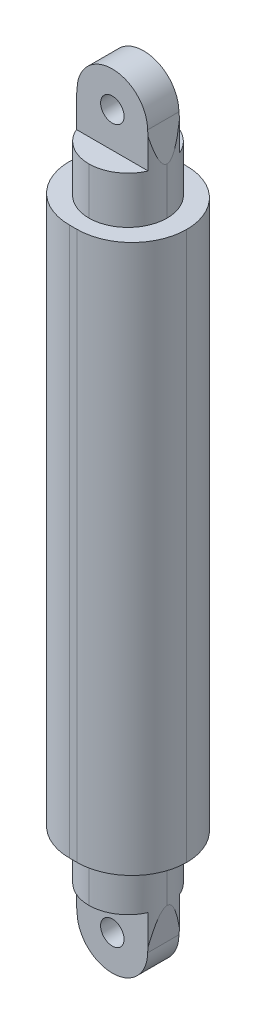
ISO-10303-21;
HEADER;
FILE_DESCRIPTION(('STEP AP214'),'2;1');
FILE_NAME('part.step','',(''),(''),'','','');
FILE_SCHEMA(('AUTOMOTIVE_DESIGN { 1 0 10303 214 1 1 1 1 }'));
ENDSEC;
DATA;
#1=APPLICATION_CONTEXT('core data for automotive mechanical design processes');
#2=APPLICATION_PROTOCOL_DEFINITION('international standard','automotive_design',2000,#1);
#3=PRODUCT_CONTEXT('',#1,'mechanical');
#4=PRODUCT('Part','Part','',(#3));
#5=PRODUCT_RELATED_PRODUCT_CATEGORY('part','',(#4));
#6=PRODUCT_DEFINITION_FORMATION('','',#4);
#7=PRODUCT_DEFINITION_CONTEXT('part definition',#1,'design');
#8=PRODUCT_DEFINITION('design','',#6,#7);
#9=PRODUCT_DEFINITION_SHAPE('','',#8);
#10=(LENGTH_UNIT() NAMED_UNIT(*) SI_UNIT(.MILLI.,.METRE.));
#11=(NAMED_UNIT(*) PLANE_ANGLE_UNIT() SI_UNIT($,.RADIAN.));
#12=(NAMED_UNIT(*) SI_UNIT($,.STERADIAN.) SOLID_ANGLE_UNIT());
#13=UNCERTAINTY_MEASURE_WITH_UNIT(LENGTH_MEASURE(1.E-05),#10,'distance_accuracy_value','');
#14=(GEOMETRIC_REPRESENTATION_CONTEXT(3) GLOBAL_UNCERTAINTY_ASSIGNED_CONTEXT((#13)) GLOBAL_UNIT_ASSIGNED_CONTEXT((#10,
#11,#12)) REPRESENTATION_CONTEXT('',''));
#15=CARTESIAN_POINT('',(0.,0.,0.));
#16=DIRECTION('',(0.,0.,1.));
#17=DIRECTION('',(1.,0.,0.));
#18=AXIS2_PLACEMENT_3D('',#15,#16,#17);
#19=CARTESIAN_POINT('',(0.,0.,5.));
#20=DIRECTION('',(0.,-1.,0.));
#21=DIRECTION('',(0.,0.,-1.));
#22=AXIS2_PLACEMENT_3D('',#19,#20,#21);
#23=CYLINDRICAL_SURFACE('',#22,5.);
#24=CARTESIAN_POINT('',(0.,-35.,5.));
#25=DIRECTION('',(0.,-1.,0.));
#26=DIRECTION('',(0.,0.,-1.));
#27=AXIS2_PLACEMENT_3D('',#24,#25,#26);
#28=CIRCLE('',#27,5.);
#29=CARTESIAN_POINT('',(-5.,-35.,5.));
#30=VERTEX_POINT('',#29);
#31=CARTESIAN_POINT('',(0.,-35.,10.));
#32=VERTEX_POINT('',#31);
#33=EDGE_CURVE('E404',#30,#32,#28,.F.);
#34=ORIENTED_EDGE('',*,*,#33,.F.);
#35=DIRECTION('',(0.,-1.,0.));
#36=VECTOR('',#35,1.);
#37=CARTESIAN_POINT('',(-5.,-50.,5.));
#38=LINE('',#37,#36);
#39=CARTESIAN_POINT('',(-5.,-41.,5.));
#40=VERTEX_POINT('',#39);
#41=EDGE_CURVE('E497',#40,#30,#38,.F.);
#42=ORIENTED_EDGE('',*,*,#41,.F.);
#43=CARTESIAN_POINT('',(0.,-85.9999999999999,5.));
#44=DIRECTION('',(0.993883734673619,0.110431526074847,0.));
#45=DIRECTION('',(0.110431526074847,-0.993883734673619,0.));
#46=AXIS2_PLACEMENT_3D('',#43,#44,#45);
#47=ELLIPSE('',#46,45.276925690687,5.);
#48=CARTESIAN_POINT('',(-4.58257569495584,-44.7568187453974,7.));
#49=VERTEX_POINT('',#48);
#50=EDGE_CURVE('E440',#49,#40,#47,.F.);
#51=ORIENTED_EDGE('',*,*,#50,.F.);
#52=DIRECTION('',(0.,-1.,0.));
#53=VECTOR('',#52,1.);
#54=CARTESIAN_POINT('',(-4.58257569495584,0.,7.));
#55=LINE('',#54,#53);
#56=CARTESIAN_POINT('',(-4.58257569495584,-41.,7.));
#57=VERTEX_POINT('',#56);
#58=EDGE_CURVE('E510',#57,#49,#55,.T.);
#59=ORIENTED_EDGE('',*,*,#58,.F.);
#60=CARTESIAN_POINT('',(0.,-41.,5.));
#61=DIRECTION('',(0.,-1.,0.));
#62=DIRECTION('',(0.,0.,-1.));
#63=AXIS2_PLACEMENT_3D('',#60,#61,#62);
#64=CIRCLE('',#63,5.);
#65=CARTESIAN_POINT('',(0.,-41.,10.));
#66=VERTEX_POINT('',#65);
#67=EDGE_CURVE('E513',#57,#66,#64,.F.);
#68=ORIENTED_EDGE('',*,*,#67,.T.);
#69=DIRECTION('',(0.,1.,0.));
#70=VECTOR('',#69,1.);
#71=CARTESIAN_POINT('',(0.,0.,10.));
#72=LINE('',#71,#70);
#73=EDGE_CURVE('E503',#66,#32,#72,.T.);
#74=ORIENTED_EDGE('',*,*,#73,.T.);
#75=EDGE_LOOP('',(#34,#42,#51,#59,#68,#74));
#76=FACE_BOUND('',#75,.T.);
#77=ADVANCED_FACE('F135',(#76),#23,.T.);
#78=CARTESIAN_POINT('',(0.,-50.,5.));
#79=DIRECTION('',(0.,1.,0.));
#80=DIRECTION('',(0.,0.,1.));
#81=AXIS2_PLACEMENT_3D('',#78,#79,#80);
#82=CYLINDRICAL_SURFACE('',#81,5.);
#83=CARTESIAN_POINT('',(0.,-35.,5.));
#84=DIRECTION('',(0.,-1.,0.));
#85=DIRECTION('',(0.,0.,-1.));
#86=AXIS2_PLACEMENT_3D('',#83,#84,#85);
#87=CIRCLE('',#86,5.);
#88=CARTESIAN_POINT('',(0.,-35.,0.));
#89=VERTEX_POINT('',#88);
#90=EDGE_CURVE('E401',#89,#30,#87,.F.);
#91=ORIENTED_EDGE('',*,*,#90,.F.);
#92=DIRECTION('',(0.,1.,0.));
#93=VECTOR('',#92,1.);
#94=CARTESIAN_POINT('',(0.,-50.,0.));
#95=LINE('',#94,#93);
#96=CARTESIAN_POINT('',(0.,-41.,0.));
#97=VERTEX_POINT('',#96);
#98=EDGE_CURVE('E500',#89,#97,#95,.F.);
#99=ORIENTED_EDGE('',*,*,#98,.T.);
#100=CARTESIAN_POINT('',(0.,-41.,5.));
#101=DIRECTION('',(0.,-1.,0.));
#102=DIRECTION('',(0.,0.,-1.));
#103=AXIS2_PLACEMENT_3D('',#100,#101,#102);
#104=CIRCLE('',#103,5.);
#105=CARTESIAN_POINT('',(-4.58257569495584,-41.,3.));
#106=VERTEX_POINT('',#105);
#107=EDGE_CURVE('E507',#97,#106,#104,.F.);
#108=ORIENTED_EDGE('',*,*,#107,.T.);
#109=DIRECTION('',(0.,1.,0.));
#110=VECTOR('',#109,1.);
#111=CARTESIAN_POINT('',(-4.58257569495584,-50.,3.));
#112=LINE('',#111,#110);
#113=CARTESIAN_POINT('',(-4.58257569495584,-44.7568187453974,3.));
#114=VERTEX_POINT('',#113);
#115=EDGE_CURVE('E320',#114,#106,#112,.T.);
#116=ORIENTED_EDGE('',*,*,#115,.F.);
#117=CARTESIAN_POINT('',(0.,-85.9999999999999,5.));
#118=DIRECTION('',(0.993883734673619,0.110431526074847,0.));
#119=DIRECTION('',(-0.110431526074847,0.993883734673619,0.));
#120=AXIS2_PLACEMENT_3D('',#117,#118,#119);
#121=ELLIPSE('',#120,45.276925690687,5.);
#122=EDGE_CURVE('E442',#40,#114,#121,.F.);
#123=ORIENTED_EDGE('',*,*,#122,.F.);
#124=ORIENTED_EDGE('',*,*,#41,.T.);
#125=EDGE_LOOP('',(#91,#99,#108,#116,#123,#124));
#126=FACE_BOUND('',#125,.T.);
#127=ADVANCED_FACE('F582',(#126),#82,.T.);
#128=CARTESIAN_POINT('',(0.,0.,5.));
#129=DIRECTION('',(0.,1.,0.));
#130=DIRECTION('',(-1.,0.,0.));
#131=AXIS2_PLACEMENT_3D('',#128,#129,#130);
#132=CYLINDRICAL_SURFACE('',#131,5.);
#133=CARTESIAN_POINT('',(0.,-35.,5.));
#134=DIRECTION('',(0.,-1.,0.));
#135=DIRECTION('',(0.,0.,-1.));
#136=AXIS2_PLACEMENT_3D('',#133,#134,#135);
#137=CIRCLE('',#136,5.);
#138=CARTESIAN_POINT('',(5.,-35.,5.));
#139=VERTEX_POINT('',#138);
#140=EDGE_CURVE('E398',#32,#139,#137,.F.);
#141=ORIENTED_EDGE('',*,*,#140,.F.);
#142=ORIENTED_EDGE('',*,*,#73,.F.);
#143=CARTESIAN_POINT('',(0.,-41.,5.));
#144=DIRECTION('',(0.,-1.,0.));
#145=DIRECTION('',(0.,0.,-1.));
#146=AXIS2_PLACEMENT_3D('',#143,#144,#145);
#147=CIRCLE('',#146,5.);
#148=CARTESIAN_POINT('',(4.58257569495584,-41.,7.));
#149=VERTEX_POINT('',#148);
#150=EDGE_CURVE('E484',#66,#149,#147,.F.);
#151=ORIENTED_EDGE('',*,*,#150,.T.);
#152=DIRECTION('',(0.,1.,0.));
#153=VECTOR('',#152,1.);
#154=CARTESIAN_POINT('',(4.58257569495584,0.,7.));
#155=LINE('',#154,#153);
#156=CARTESIAN_POINT('',(4.58257569495584,-44.7568187453974,7.));
#157=VERTEX_POINT('',#156);
#158=EDGE_CURVE('E482',#157,#149,#155,.T.);
#159=ORIENTED_EDGE('',*,*,#158,.F.);
#160=CARTESIAN_POINT('',(0.,-85.9999999999999,5.));
#161=DIRECTION('',(0.993883734673619,-0.110431526074847,0.));
#162=DIRECTION('',(0.110431526074847,0.993883734673619,0.));
#163=AXIS2_PLACEMENT_3D('',#160,#161,#162);
#164=ELLIPSE('',#163,45.2769256906869,5.);
#165=CARTESIAN_POINT('',(5.,-41.,5.));
#166=VERTEX_POINT('',#165);
#167=EDGE_CURVE('E450',#157,#166,#164,.F.);
#168=ORIENTED_EDGE('',*,*,#167,.T.);
#169=DIRECTION('',(0.,1.,0.));
#170=VECTOR('',#169,1.);
#171=CARTESIAN_POINT('',(5.,-50.,5.));
#172=LINE('',#171,#170);
#173=EDGE_CURVE('E321',#139,#166,#172,.F.);
#174=ORIENTED_EDGE('',*,*,#173,.F.);
#175=EDGE_LOOP('',(#141,#142,#151,#159,#168,#174));
#176=FACE_BOUND('',#175,.T.);
#177=ADVANCED_FACE('F589',(#176),#132,.T.);
#178=CARTESIAN_POINT('',(0.,-50.,5.));
#179=DIRECTION('',(0.,-1.,0.));
#180=DIRECTION('',(1.,0.,0.));
#181=AXIS2_PLACEMENT_3D('',#178,#179,#180);
#182=CYLINDRICAL_SURFACE('',#181,5.);
#183=CARTESIAN_POINT('',(0.,-35.,5.));
#184=DIRECTION('',(0.,-1.,0.));
#185=DIRECTION('',(0.,0.,-1.));
#186=AXIS2_PLACEMENT_3D('',#183,#184,#185);
#187=CIRCLE('',#186,5.);
#188=EDGE_CURVE('E336',#139,#89,#187,.F.);
#189=ORIENTED_EDGE('',*,*,#188,.F.);
#190=ORIENTED_EDGE('',*,*,#173,.T.);
#191=CARTESIAN_POINT('',(0.,-85.9999999999999,5.));
#192=DIRECTION('',(0.993883734673619,-0.110431526074847,0.));
#193=DIRECTION('',(-0.110431526074847,-0.993883734673619,0.));
#194=AXIS2_PLACEMENT_3D('',#191,#192,#193);
#195=ELLIPSE('',#194,45.2769256906869,5.);
#196=CARTESIAN_POINT('',(4.58257569495584,-44.7568187453974,3.));
#197=VERTEX_POINT('',#196);
#198=EDGE_CURVE('E453',#166,#197,#195,.F.);
#199=ORIENTED_EDGE('',*,*,#198,.T.);
#200=DIRECTION('',(0.,-1.,0.));
#201=VECTOR('',#200,1.);
#202=CARTESIAN_POINT('',(4.58257569495584,-50.,3.));
#203=LINE('',#202,#201);
#204=CARTESIAN_POINT('',(4.58257569495584,-41.,3.));
#205=VERTEX_POINT('',#204);
#206=EDGE_CURVE('E490',#205,#197,#203,.T.);
#207=ORIENTED_EDGE('',*,*,#206,.F.);
#208=CARTESIAN_POINT('',(0.,-41.,5.));
#209=DIRECTION('',(0.,-1.,0.));
#210=DIRECTION('',(0.,0.,-1.));
#211=AXIS2_PLACEMENT_3D('',#208,#209,#210);
#212=CIRCLE('',#211,5.);
#213=EDGE_CURVE('E493',#205,#97,#212,.F.);
#214=ORIENTED_EDGE('',*,*,#213,.T.);
#215=ORIENTED_EDGE('',*,*,#98,.F.);
#216=EDGE_LOOP('',(#189,#190,#199,#207,#214,#215));
#217=FACE_BOUND('',#216,.T.);
#218=ADVANCED_FACE('F576',(#217),#182,.T.);
#219=CARTESIAN_POINT('',(0.,-41.,3.));
#220=DIRECTION('',(0.,-1.,0.));
#221=DIRECTION('',(0.,0.,-1.));
#222=AXIS2_PLACEMENT_3D('',#219,#220,#221);
#223=PLANE('',#222);
#224=DIRECTION('',(-1.,0.,0.));
#225=VECTOR('',#224,1.);
#226=CARTESIAN_POINT('',(0.,-41.,3.));
#227=LINE('',#226,#225);
#228=EDGE_CURVE('E487',#205,#106,#227,.T.);
#229=ORIENTED_EDGE('',*,*,#228,.T.);
#230=ORIENTED_EDGE('',*,*,#107,.F.);
#231=ORIENTED_EDGE('',*,*,#213,.F.);
#232=EDGE_LOOP('',(#229,#230,#231));
#233=FACE_BOUND('',#232,.T.);
#234=ADVANCED_FACE('F607',(#233),#223,.T.);
#235=CARTESIAN_POINT('',(0.,0.,3.));
#236=DIRECTION('',(0.,0.,1.));
#237=DIRECTION('',(1.,0.,0.));
#238=AXIS2_PLACEMENT_3D('',#235,#236,#237);
#239=PLANE('',#238);
#240=CARTESIAN_POINT('',(0.,-45.5,3.));
#241=DIRECTION('',(0.,0.,-1.));
#242=DIRECTION('',(-1.,0.,0.));
#243=AXIS2_PLACEMENT_3D('',#240,#241,#242);
#244=CIRCLE('',#243,1.5);
#245=CARTESIAN_POINT('',(-1.5,-45.5,3.));
#246=VERTEX_POINT('',#245);
#247=EDGE_CURVE('E433',#246,#246,#244,.T.);
#248=ORIENTED_EDGE('',*,*,#247,.F.);
#249=EDGE_LOOP('',(#248));
#250=FACE_BOUND('',#249,.T.);
#251=CARTESIAN_POINT('',(0.,-45.5,3.));
#252=DIRECTION('',(0.,0.,1.));
#253=DIRECTION('',(1.,0.,0.));
#254=AXIS2_PLACEMENT_3D('',#251,#252,#253);
#255=CIRCLE('',#254,4.5);
#256=CARTESIAN_POINT('',(4.5,-45.5,3.));
#257=VERTEX_POINT('',#256);
#258=CARTESIAN_POINT('',(-4.5,-45.5,3.));
#259=VERTEX_POINT('',#258);
#260=EDGE_CURVE('E458',#257,#259,#255,.F.);
#261=ORIENTED_EDGE('',*,*,#260,.T.);
#262=DIRECTION('',(-0.110431526074847,0.993883734673619,0.));
#263=VECTOR('',#262,1.);
#264=CARTESIAN_POINT('',(-9.43902439024391,-1.04878048780488,3.));
#265=LINE('',#264,#263);
#266=EDGE_CURVE('E444',#259,#114,#265,.T.);
#267=ORIENTED_EDGE('',*,*,#266,.T.);
#268=ORIENTED_EDGE('',*,*,#115,.T.);
#269=ORIENTED_EDGE('',*,*,#228,.F.);
#270=ORIENTED_EDGE('',*,*,#206,.T.);
#271=DIRECTION('',(0.110431526074847,0.993883734673619,0.));
#272=VECTOR('',#271,1.);
#273=CARTESIAN_POINT('',(9.43902439024392,-1.04878048780488,3.));
#274=LINE('',#273,#272);
#275=EDGE_CURVE('E456',#257,#197,#274,.T.);
#276=ORIENTED_EDGE('',*,*,#275,.F.);
#277=EDGE_LOOP('',(#261,#267,#268,#269,#270,#276));
#278=FACE_BOUND('',#277,.T.);
#279=ADVANCED_FACE('F610',(#250,#278),#239,.F.);
#280=CARTESIAN_POINT('',(5.,-41.,10.));
#281=DIRECTION('',(0.,-1.,0.));
#282=DIRECTION('',(0.,0.,-1.));
#283=AXIS2_PLACEMENT_3D('',#280,#281,#282);
#284=PLANE('',#283);
#285=ORIENTED_EDGE('',*,*,#67,.F.);
#286=DIRECTION('',(-1.,0.,0.));
#287=VECTOR('',#286,1.);
#288=CARTESIAN_POINT('',(5.,-41.,7.));
#289=LINE('',#288,#287);
#290=EDGE_CURVE('E480',#149,#57,#289,.T.);
#291=ORIENTED_EDGE('',*,*,#290,.F.);
#292=ORIENTED_EDGE('',*,*,#150,.F.);
#293=EDGE_LOOP('',(#285,#291,#292));
#294=FACE_BOUND('',#293,.T.);
#295=ADVANCED_FACE('F614',(#294),#284,.T.);
#296=CARTESIAN_POINT('',(0.,0.,7.));
#297=DIRECTION('',(0.,0.,-1.));
#298=DIRECTION('',(-1.,0.,0.));
#299=AXIS2_PLACEMENT_3D('',#296,#297,#298);
#300=PLANE('',#299);
#301=CARTESIAN_POINT('',(0.,-45.5,7.));
#302=DIRECTION('',(0.,0.,-1.));
#303=DIRECTION('',(-1.,0.,0.));
#304=AXIS2_PLACEMENT_3D('',#301,#302,#303);
#305=CIRCLE('',#304,1.5);
#306=CARTESIAN_POINT('',(-1.5,-45.5,7.));
#307=VERTEX_POINT('',#306);
#308=EDGE_CURVE('E436',#307,#307,#305,.T.);
#309=ORIENTED_EDGE('',*,*,#308,.T.);
#310=EDGE_LOOP('',(#309));
#311=FACE_BOUND('',#310,.T.);
#312=DIRECTION('',(0.110431526074847,-0.993883734673619,0.));
#313=VECTOR('',#312,1.);
#314=CARTESIAN_POINT('',(-9.43902439024391,-1.04878048780488,7.));
#315=LINE('',#314,#313);
#316=CARTESIAN_POINT('',(-4.5,-45.5,7.));
#317=VERTEX_POINT('',#316);
#318=EDGE_CURVE('E526',#49,#317,#315,.T.);
#319=ORIENTED_EDGE('',*,*,#318,.T.);
#320=CARTESIAN_POINT('',(0.,-45.5,7.));
#321=DIRECTION('',(0.,0.,-1.));
#322=DIRECTION('',(-1.,0.,0.));
#323=AXIS2_PLACEMENT_3D('',#320,#321,#322);
#324=CIRCLE('',#323,4.5);
#325=CARTESIAN_POINT('',(4.5,-45.5,7.));
#326=VERTEX_POINT('',#325);
#327=EDGE_CURVE('E523',#317,#326,#324,.F.);
#328=ORIENTED_EDGE('',*,*,#327,.T.);
#329=DIRECTION('',(-0.110431526074847,-0.993883734673619,0.));
#330=VECTOR('',#329,1.);
#331=CARTESIAN_POINT('',(9.43902439024392,-1.04878048780488,7.));
#332=LINE('',#331,#330);
#333=EDGE_CURVE('E521',#157,#326,#332,.T.);
#334=ORIENTED_EDGE('',*,*,#333,.F.);
#335=ORIENTED_EDGE('',*,*,#158,.T.);
#336=ORIENTED_EDGE('',*,*,#290,.T.);
#337=ORIENTED_EDGE('',*,*,#58,.T.);
#338=EDGE_LOOP('',(#319,#328,#334,#335,#336,#337));
#339=FACE_BOUND('',#338,.T.);
#340=ADVANCED_FACE('F616',(#311,#339),#300,.F.);
#341=CARTESIAN_POINT('',(0.,-45.5,10.));
#342=DIRECTION('',(0.,0.,-1.));
#343=DIRECTION('',(-1.,0.,0.));
#344=AXIS2_PLACEMENT_3D('',#341,#342,#343);
#345=CYLINDRICAL_SURFACE('',#344,4.5);
#346=DIRECTION('',(0.,0.,-1.));
#347=VECTOR('',#346,1.);
#348=CARTESIAN_POINT('',(4.5,-45.5,10.));
#349=LINE('',#348,#347);
#350=EDGE_CURVE('E447',#326,#257,#349,.T.);
#351=ORIENTED_EDGE('',*,*,#350,.F.);
#352=ORIENTED_EDGE('',*,*,#327,.F.);
#353=DIRECTION('',(0.,0.,-1.));
#354=VECTOR('',#353,1.);
#355=CARTESIAN_POINT('',(-4.5,-45.5,10.));
#356=LINE('',#355,#354);
#357=EDGE_CURVE('E437',#317,#259,#356,.T.);
#358=ORIENTED_EDGE('',*,*,#357,.T.);
#359=ORIENTED_EDGE('',*,*,#260,.F.);
#360=EDGE_LOOP('',(#351,#352,#358,#359));
#361=FACE_BOUND('',#360,.T.);
#362=ADVANCED_FACE('F619',(#361),#345,.T.);
#363=CARTESIAN_POINT('',(9.43902439024392,-1.04878048780488,10.));
#364=DIRECTION('',(0.993883734673619,-0.110431526074847,0.));
#365=DIRECTION('',(0.110431526074847,0.993883734673619,0.));
#366=AXIS2_PLACEMENT_3D('',#363,#364,#365);
#367=PLANE('',#366);
#368=ORIENTED_EDGE('',*,*,#275,.T.);
#369=ORIENTED_EDGE('',*,*,#198,.F.);
#370=ORIENTED_EDGE('',*,*,#167,.F.);
#371=ORIENTED_EDGE('',*,*,#333,.T.);
#372=ORIENTED_EDGE('',*,*,#350,.T.);
#373=EDGE_LOOP('',(#368,#369,#370,#371,#372));
#374=FACE_BOUND('',#373,.T.);
#375=ADVANCED_FACE('F625',(#374),#367,.T.);
#376=CARTESIAN_POINT('',(-9.43902439024391,-1.04878048780488,10.));
#377=DIRECTION('',(0.993883734673619,0.110431526074847,0.));
#378=DIRECTION('',(-0.110431526074847,0.993883734673619,0.));
#379=AXIS2_PLACEMENT_3D('',#376,#377,#378);
#380=PLANE('',#379);
#381=ORIENTED_EDGE('',*,*,#357,.F.);
#382=ORIENTED_EDGE('',*,*,#318,.F.);
#383=ORIENTED_EDGE('',*,*,#50,.T.);
#384=ORIENTED_EDGE('',*,*,#122,.T.);
#385=ORIENTED_EDGE('',*,*,#266,.F.);
#386=EDGE_LOOP('',(#381,#382,#383,#384,#385));
#387=FACE_BOUND('',#386,.T.);
#388=ADVANCED_FACE('F635',(#387),#380,.F.);
#389=CARTESIAN_POINT('',(0.,-45.5,10.));
#390=DIRECTION('',(0.,0.,-1.));
#391=DIRECTION('',(-1.,0.,0.));
#392=AXIS2_PLACEMENT_3D('',#389,#390,#391);
#393=CYLINDRICAL_SURFACE('',#392,1.5);
#394=ORIENTED_EDGE('',*,*,#247,.T.);
#395=EDGE_LOOP('',(#394));
#396=FACE_BOUND('',#395,.T.);
#397=ORIENTED_EDGE('',*,*,#308,.F.);
#398=EDGE_LOOP('',(#397));
#399=FACE_BOUND('',#398,.T.);
#400=ADVANCED_FACE('F662',(#396,#399),#393,.F.);
#401=CARTESIAN_POINT('',(-7.5,-35.,-2.));
#402=DIRECTION('',(0.,-1.,0.));
#403=DIRECTION('',(0.,0.,-1.));
#404=AXIS2_PLACEMENT_3D('',#401,#402,#403);
#405=PLANE('',#404);
#406=ORIENTED_EDGE('',*,*,#90,.T.);
#407=ORIENTED_EDGE('',*,*,#33,.T.);
#408=ORIENTED_EDGE('',*,*,#140,.T.);
#409=ORIENTED_EDGE('',*,*,#188,.T.);
#410=EDGE_LOOP('',(#406,#407,#408,#409));
#411=FACE_BOUND('',#410,.T.);
#412=CARTESIAN_POINT('',(0.500000000000017,-35.,5.));
#413=DIRECTION('',(0.,-1.,0.));
#414=DIRECTION('',(0.,0.,-1.));
#415=AXIS2_PLACEMENT_3D('',#412,#413,#414);
#416=CIRCLE('',#415,7.);
#417=CARTESIAN_POINT('',(0.500000000000014,-35.,-2.));
#418=VERTEX_POINT('',#417);
#419=CARTESIAN_POINT('',(7.50000000000002,-35.,5.));
#420=VERTEX_POINT('',#419);
#421=EDGE_CURVE('E356',#418,#420,#416,.T.);
#422=ORIENTED_EDGE('',*,*,#421,.T.);
#423=CARTESIAN_POINT('',(0.500000000000017,-35.,5.));
#424=DIRECTION('',(0.,-1.,0.));
#425=DIRECTION('',(0.,0.,-1.));
#426=AXIS2_PLACEMENT_3D('',#423,#424,#425);
#427=CIRCLE('',#426,7.);
#428=CARTESIAN_POINT('',(0.500000000000014,-35.,12.));
#429=VERTEX_POINT('',#428);
#430=EDGE_CURVE('E358',#420,#429,#427,.T.);
#431=ORIENTED_EDGE('',*,*,#430,.T.);
#432=DIRECTION('',(1.,0.,0.));
#433=VECTOR('',#432,1.);
#434=CARTESIAN_POINT('',(-7.5,-35.,12.));
#435=LINE('',#434,#433);
#436=CARTESIAN_POINT('',(-0.500000000000005,-35.,12.));
#437=VERTEX_POINT('',#436);
#438=EDGE_CURVE('E374',#437,#429,#435,.T.);
#439=ORIENTED_EDGE('',*,*,#438,.F.);
#440=CARTESIAN_POINT('',(-0.500000000000003,-35.,5.));
#441=DIRECTION('',(0.,-1.,0.));
#442=DIRECTION('',(0.,0.,-1.));
#443=AXIS2_PLACEMENT_3D('',#440,#441,#442);
#444=CIRCLE('',#443,7.);
#445=CARTESIAN_POINT('',(-7.5,-35.,5.));
#446=VERTEX_POINT('',#445);
#447=EDGE_CURVE('E354',#437,#446,#444,.T.);
#448=ORIENTED_EDGE('',*,*,#447,.T.);
#449=CARTESIAN_POINT('',(-0.500000000000003,-35.,5.));
#450=DIRECTION('',(0.,-1.,0.));
#451=DIRECTION('',(0.,0.,-1.));
#452=AXIS2_PLACEMENT_3D('',#449,#450,#451);
#453=CIRCLE('',#452,7.);
#454=CARTESIAN_POINT('',(-0.500000000000005,-35.,-2.));
#455=VERTEX_POINT('',#454);
#456=EDGE_CURVE('E352',#446,#455,#453,.T.);
#457=ORIENTED_EDGE('',*,*,#456,.T.);
#458=DIRECTION('',(1.,0.,0.));
#459=VECTOR('',#458,1.);
#460=CARTESIAN_POINT('',(-7.5,-35.,-2.));
#461=LINE('',#460,#459);
#462=EDGE_CURVE('E332',#455,#418,#461,.T.);
#463=ORIENTED_EDGE('',*,*,#462,.T.);
#464=EDGE_LOOP('',(#422,#431,#439,#448,#457,#463));
#465=FACE_BOUND('',#464,.T.);
#466=ADVANCED_FACE('F389',(#411,#465),#405,.T.);
#467=CARTESIAN_POINT('',(-7.5,35.,-2.));
#468=DIRECTION('',(0.,1.,0.));
#469=DIRECTION('',(-1.,0.,0.));
#470=AXIS2_PLACEMENT_3D('',#467,#468,#469);
#471=PLANE('',#470);
#472=CARTESIAN_POINT('',(0.,35.,5.));
#473=DIRECTION('',(0.,1.,0.));
#474=DIRECTION('',(-1.,0.,0.));
#475=AXIS2_PLACEMENT_3D('',#472,#473,#474);
#476=CIRCLE('',#475,5.);
#477=CARTESIAN_POINT('',(5.,35.,5.));
#478=VERTEX_POINT('',#477);
#479=CARTESIAN_POINT('',(0.,35.,10.));
#480=VERTEX_POINT('',#479);
#481=EDGE_CURVE('E325',#478,#480,#476,.F.);
#482=ORIENTED_EDGE('',*,*,#481,.T.);
#483=CARTESIAN_POINT('',(0.,35.,5.));
#484=DIRECTION('',(0.,1.,0.));
#485=DIRECTION('',(-1.,0.,0.));
#486=AXIS2_PLACEMENT_3D('',#483,#484,#485);
#487=CIRCLE('',#486,5.);
#488=CARTESIAN_POINT('',(-5.,35.,5.));
#489=VERTEX_POINT('',#488);
#490=EDGE_CURVE('E396',#480,#489,#487,.F.);
#491=ORIENTED_EDGE('',*,*,#490,.T.);
#492=CARTESIAN_POINT('',(0.,35.,5.));
#493=DIRECTION('',(0.,1.,0.));
#494=DIRECTION('',(-1.,0.,0.));
#495=AXIS2_PLACEMENT_3D('',#492,#493,#494);
#496=CIRCLE('',#495,5.);
#497=CARTESIAN_POINT('',(0.,35.,0.));
#498=VERTEX_POINT('',#497);
#499=EDGE_CURVE('E331',#489,#498,#496,.F.);
#500=ORIENTED_EDGE('',*,*,#499,.T.);
#501=CARTESIAN_POINT('',(0.,35.,5.));
#502=DIRECTION('',(0.,1.,0.));
#503=DIRECTION('',(-1.,0.,0.));
#504=AXIS2_PLACEMENT_3D('',#501,#502,#503);
#505=CIRCLE('',#504,5.);
#506=EDGE_CURVE('E314',#498,#478,#505,.F.);
#507=ORIENTED_EDGE('',*,*,#506,.T.);
#508=EDGE_LOOP('',(#482,#491,#500,#507));
#509=FACE_BOUND('',#508,.T.);
#510=DIRECTION('',(-1.,0.,0.));
#511=VECTOR('',#510,1.);
#512=CARTESIAN_POINT('',(-7.5,35.,12.));
#513=LINE('',#512,#511);
#514=CARTESIAN_POINT('',(0.499999999999997,35.,12.));
#515=VERTEX_POINT('',#514);
#516=CARTESIAN_POINT('',(-0.500000000000003,35.,12.));
#517=VERTEX_POINT('',#516);
#518=EDGE_CURVE('E369',#515,#517,#513,.T.);
#519=ORIENTED_EDGE('',*,*,#518,.F.);
#520=CARTESIAN_POINT('',(0.499999999999996,35.,5.));
#521=DIRECTION('',(0.,1.,0.));
#522=DIRECTION('',(-1.,0.,0.));
#523=AXIS2_PLACEMENT_3D('',#520,#521,#522);
#524=CIRCLE('',#523,7.);
#525=CARTESIAN_POINT('',(7.5,35.,5.));
#526=VERTEX_POINT('',#525);
#527=EDGE_CURVE('E365',#515,#526,#524,.T.);
#528=ORIENTED_EDGE('',*,*,#527,.T.);
#529=CARTESIAN_POINT('',(0.499999999999996,35.,5.));
#530=DIRECTION('',(0.,1.,0.));
#531=DIRECTION('',(-1.,0.,0.));
#532=AXIS2_PLACEMENT_3D('',#529,#530,#531);
#533=CIRCLE('',#532,7.);
#534=CARTESIAN_POINT('',(0.499999999999997,35.,-2.));
#535=VERTEX_POINT('',#534);
#536=EDGE_CURVE('E158',#526,#535,#533,.T.);
#537=ORIENTED_EDGE('',*,*,#536,.T.);
#538=DIRECTION('',(-1.,0.,0.));
#539=VECTOR('',#538,1.);
#540=CARTESIAN_POINT('',(-7.5,35.,-2.));
#541=LINE('',#540,#539);
#542=CARTESIAN_POINT('',(-0.500000000000003,35.,-2.));
#543=VERTEX_POINT('',#542);
#544=EDGE_CURVE('E387',#535,#543,#541,.T.);
#545=ORIENTED_EDGE('',*,*,#544,.T.);
#546=CARTESIAN_POINT('',(-0.500000000000003,35.,5.));
#547=DIRECTION('',(0.,1.,0.));
#548=DIRECTION('',(-1.,0.,0.));
#549=AXIS2_PLACEMENT_3D('',#546,#547,#548);
#550=CIRCLE('',#549,7.);
#551=CARTESIAN_POINT('',(-7.5,35.,5.));
#552=VERTEX_POINT('',#551);
#553=EDGE_CURVE('E360',#543,#552,#550,.T.);
#554=ORIENTED_EDGE('',*,*,#553,.T.);
#555=CARTESIAN_POINT('',(-0.500000000000003,35.,5.));
#556=DIRECTION('',(0.,1.,0.));
#557=DIRECTION('',(-1.,0.,0.));
#558=AXIS2_PLACEMENT_3D('',#555,#556,#557);
#559=CIRCLE('',#558,7.);
#560=EDGE_CURVE('E362',#552,#517,#559,.T.);
#561=ORIENTED_EDGE('',*,*,#560,.T.);
#562=EDGE_LOOP('',(#519,#528,#537,#545,#554,#561));
#563=FACE_BOUND('',#562,.T.);
#564=ADVANCED_FACE('F335',(#509,#563),#471,.T.);
#565=CARTESIAN_POINT('',(0.,0.,-2.));
#566=DIRECTION('',(0.,0.,-1.));
#567=DIRECTION('',(-1.,0.,0.));
#568=AXIS2_PLACEMENT_3D('',#565,#566,#567);
#569=PLANE('',#568);
#570=ORIENTED_EDGE('',*,*,#544,.F.);
#571=DIRECTION('',(0.,1.,0.));
#572=VECTOR('',#571,1.);
#573=CARTESIAN_POINT('',(0.500000000000007,0.,-2.));
#574=LINE('',#573,#572);
#575=EDGE_CURVE('E12',#535,#418,#574,.F.);
#576=ORIENTED_EDGE('',*,*,#575,.T.);
#577=ORIENTED_EDGE('',*,*,#462,.F.);
#578=DIRECTION('',(0.,-1.,0.));
#579=VECTOR('',#578,1.);
#580=CARTESIAN_POINT('',(-0.500000000000003,0.,-2.));
#581=LINE('',#580,#579);
#582=EDGE_CURVE('E144',#455,#543,#581,.F.);
#583=ORIENTED_EDGE('',*,*,#582,.T.);
#584=EDGE_LOOP('',(#570,#576,#577,#583));
#585=FACE_BOUND('',#584,.T.);
#586=ADVANCED_FACE('F386',(#585),#569,.T.);
#587=CARTESIAN_POINT('',(0.,0.,12.));
#588=DIRECTION('',(0.,0.,-1.));
#589=DIRECTION('',(-1.,0.,0.));
#590=AXIS2_PLACEMENT_3D('',#587,#588,#589);
#591=PLANE('',#590);
#592=ORIENTED_EDGE('',*,*,#518,.T.);
#593=DIRECTION('',(0.,-1.,0.));
#594=VECTOR('',#593,1.);
#595=CARTESIAN_POINT('',(-0.500000000000003,-35.,12.));
#596=LINE('',#595,#594);
#597=EDGE_CURVE('E349',#517,#437,#596,.T.);
#598=ORIENTED_EDGE('',*,*,#597,.T.);
#599=ORIENTED_EDGE('',*,*,#438,.T.);
#600=DIRECTION('',(0.,1.,0.));
#601=VECTOR('',#600,1.);
#602=CARTESIAN_POINT('',(0.499999999999996,35.,12.));
#603=LINE('',#602,#601);
#604=EDGE_CURVE('E340',#429,#515,#603,.T.);
#605=ORIENTED_EDGE('',*,*,#604,.T.);
#606=EDGE_LOOP('',(#592,#598,#599,#605));
#607=FACE_BOUND('',#606,.T.);
#608=ADVANCED_FACE('F684',(#607),#591,.F.);
#609=CARTESIAN_POINT('',(0.,45.5,10.));
#610=DIRECTION('',(0.,0.,-1.));
#611=DIRECTION('',(-1.,0.,0.));
#612=AXIS2_PLACEMENT_3D('',#609,#610,#611);
#613=CYLINDRICAL_SURFACE('',#612,4.5);
#614=CARTESIAN_POINT('',(0.,45.5,3.));
#615=DIRECTION('',(0.,0.,1.));
#616=DIRECTION('',(1.,0.,0.));
#617=AXIS2_PLACEMENT_3D('',#614,#615,#616);
#618=CIRCLE('',#617,4.5);
#619=CARTESIAN_POINT('',(4.5,45.5,3.));
#620=VERTEX_POINT('',#619);
#621=CARTESIAN_POINT('',(-4.5,45.5,3.));
#622=VERTEX_POINT('',#621);
#623=EDGE_CURVE('E427',#620,#622,#618,.T.);
#624=ORIENTED_EDGE('',*,*,#623,.T.);
#625=DIRECTION('',(0.,0.,-1.));
#626=VECTOR('',#625,1.);
#627=CARTESIAN_POINT('',(-4.5,45.5,10.));
#628=LINE('',#627,#626);
#629=CARTESIAN_POINT('',(-4.5,45.5,7.));
#630=VERTEX_POINT('',#629);
#631=EDGE_CURVE('E407',#630,#622,#628,.T.);
#632=ORIENTED_EDGE('',*,*,#631,.F.);
#633=CARTESIAN_POINT('',(0.,45.5,7.));
#634=DIRECTION('',(0.,0.,-1.));
#635=DIRECTION('',(-1.,0.,0.));
#636=AXIS2_PLACEMENT_3D('',#633,#634,#635);
#637=CIRCLE('',#636,4.5);
#638=CARTESIAN_POINT('',(4.5,45.5,7.));
#639=VERTEX_POINT('',#638);
#640=EDGE_CURVE('E343',#630,#639,#637,.T.);
#641=ORIENTED_EDGE('',*,*,#640,.T.);
#642=DIRECTION('',(0.,0.,-1.));
#643=VECTOR('',#642,1.);
#644=CARTESIAN_POINT('',(4.5,45.5,10.));
#645=LINE('',#644,#643);
#646=EDGE_CURVE('E418',#639,#620,#645,.T.);
#647=ORIENTED_EDGE('',*,*,#646,.T.);
#648=EDGE_LOOP('',(#624,#632,#641,#647));
#649=FACE_BOUND('',#648,.T.);
#650=ADVANCED_FACE('F538',(#649),#613,.T.);
#651=CARTESIAN_POINT('',(0.,45.5,10.));
#652=DIRECTION('',(0.,0.,-1.));
#653=DIRECTION('',(-1.,0.,0.));
#654=AXIS2_PLACEMENT_3D('',#651,#652,#653);
#655=CYLINDRICAL_SURFACE('',#654,1.5);
#656=CARTESIAN_POINT('',(0.,45.5,3.));
#657=DIRECTION('',(0.,0.,1.));
#658=DIRECTION('',(-1.,0.,0.));
#659=AXIS2_PLACEMENT_3D('',#656,#657,#658);
#660=CIRCLE('',#659,1.5);
#661=CARTESIAN_POINT('',(-1.5,45.5,3.));
#662=VERTEX_POINT('',#661);
#663=EDGE_CURVE('E429',#662,#662,#660,.T.);
#664=ORIENTED_EDGE('',*,*,#663,.F.);
#665=EDGE_LOOP('',(#664));
#666=FACE_BOUND('',#665,.T.);
#667=CARTESIAN_POINT('',(0.,45.5,7.));
#668=DIRECTION('',(0.,0.,-1.));
#669=DIRECTION('',(-1.,0.,0.));
#670=AXIS2_PLACEMENT_3D('',#667,#668,#669);
#671=CIRCLE('',#670,1.5);
#672=CARTESIAN_POINT('',(-1.5,45.5,7.));
#673=VERTEX_POINT('',#672);
#674=EDGE_CURVE('E432',#673,#673,#671,.F.);
#675=ORIENTED_EDGE('',*,*,#674,.T.);
#676=EDGE_LOOP('',(#675));
#677=FACE_BOUND('',#676,.T.);
#678=ADVANCED_FACE('F671',(#666,#677),#655,.F.);
#679=CARTESIAN_POINT('',(-9.43902439024391,1.04878048780488,10.));
#680=DIRECTION('',(-0.993883734673619,0.110431526074847,0.));
#681=DIRECTION('',(-0.110431526074847,-0.993883734673619,0.));
#682=AXIS2_PLACEMENT_3D('',#679,#680,#681);
#683=PLANE('',#682);
#684=DIRECTION('',(-0.110431526074847,-0.993883734673619,0.));
#685=VECTOR('',#684,1.);
#686=CARTESIAN_POINT('',(-9.43902439024391,1.04878048780488,3.));
#687=LINE('',#686,#685);
#688=CARTESIAN_POINT('',(-4.58257569495584,44.7568187453974,3.));
#689=VERTEX_POINT('',#688);
#690=EDGE_CURVE('E416',#622,#689,#687,.T.);
#691=ORIENTED_EDGE('',*,*,#690,.T.);
#692=CARTESIAN_POINT('',(0.,85.9999999999999,5.));
#693=DIRECTION('',(-0.993883734673619,0.110431526074847,0.));
#694=DIRECTION('',(0.110431526074847,0.993883734673619,0.));
#695=AXIS2_PLACEMENT_3D('',#692,#693,#694);
#696=ELLIPSE('',#695,45.276925690687,5.);
#697=CARTESIAN_POINT('',(-5.,41.,5.));
#698=VERTEX_POINT('',#697);
#699=EDGE_CURVE('E337',#698,#689,#696,.F.);
#700=ORIENTED_EDGE('',*,*,#699,.F.);
#701=CARTESIAN_POINT('',(0.,85.9999999999999,5.));
#702=DIRECTION('',(-0.993883734673619,0.110431526074847,0.));
#703=DIRECTION('',(-0.110431526074847,-0.993883734673619,0.));
#704=AXIS2_PLACEMENT_3D('',#701,#702,#703);
#705=ELLIPSE('',#704,45.276925690687,5.);
#706=CARTESIAN_POINT('',(-4.58257569495584,44.7568187453974,7.));
#707=VERTEX_POINT('',#706);
#708=EDGE_CURVE('E410',#707,#698,#705,.F.);
#709=ORIENTED_EDGE('',*,*,#708,.F.);
#710=DIRECTION('',(0.110431526074847,0.993883734673619,0.));
#711=VECTOR('',#710,1.);
#712=CARTESIAN_POINT('',(-9.43902439024391,1.04878048780488,7.));
#713=LINE('',#712,#711);
#714=EDGE_CURVE('E413',#707,#630,#713,.T.);
#715=ORIENTED_EDGE('',*,*,#714,.T.);
#716=ORIENTED_EDGE('',*,*,#631,.T.);
#717=EDGE_LOOP('',(#691,#700,#709,#715,#716));
#718=FACE_BOUND('',#717,.T.);
#719=ADVANCED_FACE('F559',(#718),#683,.T.);
#720=CARTESIAN_POINT('',(5.,41.,10.));
#721=DIRECTION('',(0.,-1.,0.));
#722=DIRECTION('',(0.,0.,-1.));
#723=AXIS2_PLACEMENT_3D('',#720,#721,#722);
#724=PLANE('',#723);
#725=CARTESIAN_POINT('',(0.,41.,5.));
#726=DIRECTION('',(0.,-1.,0.));
#727=DIRECTION('',(0.,0.,-1.));
#728=AXIS2_PLACEMENT_3D('',#725,#726,#727);
#729=CIRCLE('',#728,5.);
#730=CARTESIAN_POINT('',(0.,41.,10.));
#731=VERTEX_POINT('',#730);
#732=CARTESIAN_POINT('',(4.58257569495584,41.,7.));
#733=VERTEX_POINT('',#732);
#734=EDGE_CURVE('E468',#731,#733,#729,.F.);
#735=ORIENTED_EDGE('',*,*,#734,.T.);
#736=DIRECTION('',(-1.,0.,0.));
#737=VECTOR('',#736,1.);
#738=CARTESIAN_POINT('',(5.,41.,7.));
#739=LINE('',#738,#737);
#740=CARTESIAN_POINT('',(-4.58257569495584,41.,7.));
#741=VERTEX_POINT('',#740);
#742=EDGE_CURVE('E460',#733,#741,#739,.T.);
#743=ORIENTED_EDGE('',*,*,#742,.T.);
#744=CARTESIAN_POINT('',(0.,41.,5.));
#745=DIRECTION('',(0.,-1.,0.));
#746=DIRECTION('',(0.,0.,-1.));
#747=AXIS2_PLACEMENT_3D('',#744,#745,#746);
#748=CIRCLE('',#747,5.);
#749=EDGE_CURVE('E518',#741,#731,#748,.F.);
#750=ORIENTED_EDGE('',*,*,#749,.T.);
#751=EDGE_LOOP('',(#735,#743,#750));
#752=FACE_BOUND('',#751,.T.);
#753=ADVANCED_FACE('F548',(#752),#724,.F.);
#754=CARTESIAN_POINT('',(0.,0.,7.));
#755=DIRECTION('',(0.,0.,-1.));
#756=DIRECTION('',(-1.,0.,0.));
#757=AXIS2_PLACEMENT_3D('',#754,#755,#756);
#758=PLANE('',#757);
#759=ORIENTED_EDGE('',*,*,#674,.F.);
#760=EDGE_LOOP('',(#759));
#761=FACE_BOUND('',#760,.T.);
#762=ORIENTED_EDGE('',*,*,#640,.F.);
#763=ORIENTED_EDGE('',*,*,#714,.F.);
#764=DIRECTION('',(0.,-1.,0.));
#765=VECTOR('',#764,1.);
#766=CARTESIAN_POINT('',(-4.58257569495584,0.,7.));
#767=LINE('',#766,#765);
#768=EDGE_CURVE('E463',#707,#741,#767,.T.);
#769=ORIENTED_EDGE('',*,*,#768,.T.);
#770=ORIENTED_EDGE('',*,*,#742,.F.);
#771=DIRECTION('',(0.,1.,0.));
#772=VECTOR('',#771,1.);
#773=CARTESIAN_POINT('',(4.58257569495584,0.,7.));
#774=LINE('',#773,#772);
#775=CARTESIAN_POINT('',(4.58257569495584,44.7568187453974,7.));
#776=VERTEX_POINT('',#775);
#777=EDGE_CURVE('E465',#733,#776,#774,.T.);
#778=ORIENTED_EDGE('',*,*,#777,.T.);
#779=DIRECTION('',(-0.110431526074847,0.993883734673619,0.));
#780=VECTOR('',#779,1.);
#781=CARTESIAN_POINT('',(9.43902439024392,1.04878048780488,7.));
#782=LINE('',#781,#780);
#783=EDGE_CURVE('E529',#776,#639,#782,.T.);
#784=ORIENTED_EDGE('',*,*,#783,.T.);
#785=EDGE_LOOP('',(#762,#763,#769,#770,#778,#784));
#786=FACE_BOUND('',#785,.T.);
#787=ADVANCED_FACE('F542',(#761,#786),#758,.F.);
#788=CARTESIAN_POINT('',(9.43902439024392,1.04878048780488,10.));
#789=DIRECTION('',(-0.993883734673619,-0.110431526074847,0.));
#790=DIRECTION('',(0.110431526074847,-0.993883734673619,0.));
#791=AXIS2_PLACEMENT_3D('',#788,#789,#790);
#792=PLANE('',#791);
#793=ORIENTED_EDGE('',*,*,#646,.F.);
#794=ORIENTED_EDGE('',*,*,#783,.F.);
#795=CARTESIAN_POINT('',(0.,85.9999999999999,5.));
#796=DIRECTION('',(-0.993883734673619,-0.110431526074847,0.));
#797=DIRECTION('',(-0.110431526074847,0.993883734673619,0.));
#798=AXIS2_PLACEMENT_3D('',#795,#796,#797);
#799=ELLIPSE('',#798,45.2769256906869,5.);
#800=CARTESIAN_POINT('',(5.,41.,5.));
#801=VERTEX_POINT('',#800);
#802=EDGE_CURVE('E421',#776,#801,#799,.F.);
#803=ORIENTED_EDGE('',*,*,#802,.T.);
#804=CARTESIAN_POINT('',(0.,85.9999999999998,5.));
#805=DIRECTION('',(-0.993883734673619,-0.110431526074847,0.));
#806=DIRECTION('',(0.110431526074847,-0.993883734673619,0.));
#807=AXIS2_PLACEMENT_3D('',#804,#805,#806);
#808=ELLIPSE('',#807,45.2769256906869,5.);
#809=CARTESIAN_POINT('',(4.58257569495584,44.7568187453974,3.));
#810=VERTEX_POINT('',#809);
#811=EDGE_CURVE('E317',#801,#810,#808,.F.);
#812=ORIENTED_EDGE('',*,*,#811,.T.);
#813=DIRECTION('',(0.110431526074847,-0.993883734673619,0.));
#814=VECTOR('',#813,1.);
#815=CARTESIAN_POINT('',(9.43902439024392,1.04878048780488,3.));
#816=LINE('',#815,#814);
#817=EDGE_CURVE('E424',#620,#810,#816,.T.);
#818=ORIENTED_EDGE('',*,*,#817,.F.);
#819=EDGE_LOOP('',(#793,#794,#803,#812,#818));
#820=FACE_BOUND('',#819,.T.);
#821=ADVANCED_FACE('F546',(#820),#792,.F.);
#822=CARTESIAN_POINT('',(0.,0.,3.));
#823=DIRECTION('',(0.,0.,1.));
#824=DIRECTION('',(1.,0.,0.));
#825=AXIS2_PLACEMENT_3D('',#822,#823,#824);
#826=PLANE('',#825);
#827=ORIENTED_EDGE('',*,*,#663,.T.);
#828=EDGE_LOOP('',(#827));
#829=FACE_BOUND('',#828,.T.);
#830=ORIENTED_EDGE('',*,*,#690,.F.);
#831=ORIENTED_EDGE('',*,*,#623,.F.);
#832=ORIENTED_EDGE('',*,*,#817,.T.);
#833=DIRECTION('',(0.,-1.,0.));
#834=VECTOR('',#833,1.);
#835=CARTESIAN_POINT('',(4.58257569495584,-50.,3.));
#836=LINE('',#835,#834);
#837=CARTESIAN_POINT('',(4.58257569495584,41.,3.));
#838=VERTEX_POINT('',#837);
#839=EDGE_CURVE('E476',#810,#838,#836,.T.);
#840=ORIENTED_EDGE('',*,*,#839,.T.);
#841=DIRECTION('',(-1.,0.,0.));
#842=VECTOR('',#841,1.);
#843=CARTESIAN_POINT('',(0.,41.,3.));
#844=LINE('',#843,#842);
#845=CARTESIAN_POINT('',(-4.58257569495584,41.,3.));
#846=VERTEX_POINT('',#845);
#847=EDGE_CURVE('E470',#838,#846,#844,.T.);
#848=ORIENTED_EDGE('',*,*,#847,.T.);
#849=DIRECTION('',(0.,1.,0.));
#850=VECTOR('',#849,1.);
#851=CARTESIAN_POINT('',(-4.58257569495584,-50.,3.));
#852=LINE('',#851,#850);
#853=EDGE_CURVE('E473',#846,#689,#852,.T.);
#854=ORIENTED_EDGE('',*,*,#853,.T.);
#855=EDGE_LOOP('',(#830,#831,#832,#840,#848,#854));
#856=FACE_BOUND('',#855,.T.);
#857=ADVANCED_FACE('F562',(#829,#856),#826,.F.);
#858=CARTESIAN_POINT('',(0.,41.,3.));
#859=DIRECTION('',(0.,-1.,0.));
#860=DIRECTION('',(0.,0.,-1.));
#861=AXIS2_PLACEMENT_3D('',#858,#859,#860);
#862=PLANE('',#861);
#863=CARTESIAN_POINT('',(0.,41.,5.));
#864=DIRECTION('',(0.,-1.,0.));
#865=DIRECTION('',(0.,0.,-1.));
#866=AXIS2_PLACEMENT_3D('',#863,#864,#865);
#867=CIRCLE('',#866,5.);
#868=CARTESIAN_POINT('',(0.,41.,0.));
#869=VERTEX_POINT('',#868);
#870=EDGE_CURVE('E478',#838,#869,#867,.F.);
#871=ORIENTED_EDGE('',*,*,#870,.T.);
#872=CARTESIAN_POINT('',(0.,41.,5.));
#873=DIRECTION('',(0.,-1.,0.));
#874=DIRECTION('',(0.,0.,-1.));
#875=AXIS2_PLACEMENT_3D('',#872,#873,#874);
#876=CIRCLE('',#875,5.);
#877=EDGE_CURVE('E516',#869,#846,#876,.F.);
#878=ORIENTED_EDGE('',*,*,#877,.T.);
#879=ORIENTED_EDGE('',*,*,#847,.F.);
#880=EDGE_LOOP('',(#871,#878,#879));
#881=FACE_BOUND('',#880,.T.);
#882=ADVANCED_FACE('F567',(#881),#862,.F.);
#883=ORIENTED_EDGE('',*,*,#506,.F.);
#884=EDGE_CURVE('E501',#869,#498,#95,.F.);
#885=ORIENTED_EDGE('',*,*,#884,.F.);
#886=ORIENTED_EDGE('',*,*,#870,.F.);
#887=ORIENTED_EDGE('',*,*,#839,.F.);
#888=ORIENTED_EDGE('',*,*,#811,.F.);
#889=EDGE_CURVE('E309',#801,#478,#172,.F.);
#890=ORIENTED_EDGE('',*,*,#889,.T.);
#891=EDGE_LOOP('',(#883,#885,#886,#887,#888,#890));
#892=FACE_BOUND('',#891,.T.);
#893=ADVANCED_FACE('F311',(#892),#182,.T.);
#894=ORIENTED_EDGE('',*,*,#481,.F.);
#895=ORIENTED_EDGE('',*,*,#889,.F.);
#896=ORIENTED_EDGE('',*,*,#802,.F.);
#897=ORIENTED_EDGE('',*,*,#777,.F.);
#898=ORIENTED_EDGE('',*,*,#734,.F.);
#899=EDGE_CURVE('E328',#480,#731,#72,.T.);
#900=ORIENTED_EDGE('',*,*,#899,.F.);
#901=EDGE_LOOP('',(#894,#895,#896,#897,#898,#900));
#902=FACE_BOUND('',#901,.T.);
#903=ADVANCED_FACE('F326',(#902),#132,.T.);
#904=ORIENTED_EDGE('',*,*,#499,.F.);
#905=EDGE_CURVE('E496',#489,#698,#38,.F.);
#906=ORIENTED_EDGE('',*,*,#905,.T.);
#907=ORIENTED_EDGE('',*,*,#699,.T.);
#908=ORIENTED_EDGE('',*,*,#853,.F.);
#909=ORIENTED_EDGE('',*,*,#877,.F.);
#910=ORIENTED_EDGE('',*,*,#884,.T.);
#911=EDGE_LOOP('',(#904,#906,#907,#908,#909,#910));
#912=FACE_BOUND('',#911,.T.);
#913=ADVANCED_FACE('F556',(#912),#82,.T.);
#914=ORIENTED_EDGE('',*,*,#490,.F.);
#915=ORIENTED_EDGE('',*,*,#899,.T.);
#916=ORIENTED_EDGE('',*,*,#749,.F.);
#917=ORIENTED_EDGE('',*,*,#768,.F.);
#918=ORIENTED_EDGE('',*,*,#708,.T.);
#919=ORIENTED_EDGE('',*,*,#905,.F.);
#920=EDGE_LOOP('',(#914,#915,#916,#917,#918,#919));
#921=FACE_BOUND('',#920,.T.);
#922=ADVANCED_FACE('F552',(#921),#23,.T.);
#923=CARTESIAN_POINT('',(-0.500000000000003,-35.,5.));
#924=DIRECTION('',(0.,-1.,0.));
#925=DIRECTION('',(0.,0.,-1.));
#926=AXIS2_PLACEMENT_3D('',#923,#924,#925);
#927=CYLINDRICAL_SURFACE('',#926,7.);
#928=DIRECTION('',(0.,-1.,0.));
#929=VECTOR('',#928,1.);
#930=CARTESIAN_POINT('',(-7.5,-35.,5.));
#931=LINE('',#930,#929);
#932=EDGE_CURVE('E367',#552,#446,#931,.T.);
#933=ORIENTED_EDGE('',*,*,#932,.F.);
#934=ORIENTED_EDGE('',*,*,#553,.F.);
#935=ORIENTED_EDGE('',*,*,#582,.F.);
#936=ORIENTED_EDGE('',*,*,#456,.F.);
#937=EDGE_LOOP('',(#933,#934,#935,#936));
#938=FACE_BOUND('',#937,.T.);
#939=ADVANCED_FACE('F593',(#938),#927,.T.);
#940=CARTESIAN_POINT('',(-0.500000000000003,0.,5.));
#941=DIRECTION('',(0.,1.,0.));
#942=DIRECTION('',(0.,0.,1.));
#943=AXIS2_PLACEMENT_3D('',#940,#941,#942);
#944=CYLINDRICAL_SURFACE('',#943,7.);
#945=ORIENTED_EDGE('',*,*,#560,.F.);
#946=ORIENTED_EDGE('',*,*,#932,.T.);
#947=ORIENTED_EDGE('',*,*,#447,.F.);
#948=ORIENTED_EDGE('',*,*,#597,.F.);
#949=EDGE_LOOP('',(#945,#946,#947,#948));
#950=FACE_BOUND('',#949,.T.);
#951=ADVANCED_FACE('F599',(#950),#944,.T.);
#952=CARTESIAN_POINT('',(0.500000000000017,-35.,5.));
#953=DIRECTION('',(0.,1.,0.));
#954=DIRECTION('',(-1.,0.,0.));
#955=AXIS2_PLACEMENT_3D('',#952,#953,#954);
#956=CYLINDRICAL_SURFACE('',#955,7.);
#957=DIRECTION('',(0.,1.,0.));
#958=VECTOR('',#957,1.);
#959=CARTESIAN_POINT('',(7.50000000000002,-35.,5.));
#960=LINE('',#959,#958);
#961=EDGE_CURVE('E139',#420,#526,#960,.T.);
#962=ORIENTED_EDGE('',*,*,#961,.F.);
#963=ORIENTED_EDGE('',*,*,#421,.F.);
#964=ORIENTED_EDGE('',*,*,#575,.F.);
#965=ORIENTED_EDGE('',*,*,#536,.F.);
#966=EDGE_LOOP('',(#962,#963,#964,#965));
#967=FACE_BOUND('',#966,.T.);
#968=ADVANCED_FACE('F137',(#967),#956,.T.);
#969=CARTESIAN_POINT('',(0.500000000000007,0.,5.));
#970=DIRECTION('',(0.,-1.,0.));
#971=DIRECTION('',(1.,0.,0.));
#972=AXIS2_PLACEMENT_3D('',#969,#970,#971);
#973=CYLINDRICAL_SURFACE('',#972,7.);
#974=ORIENTED_EDGE('',*,*,#430,.F.);
#975=ORIENTED_EDGE('',*,*,#961,.T.);
#976=ORIENTED_EDGE('',*,*,#527,.F.);
#977=ORIENTED_EDGE('',*,*,#604,.F.);
#978=EDGE_LOOP('',(#974,#975,#976,#977));
#979=FACE_BOUND('',#978,.T.);
#980=ADVANCED_FACE('F380',(#979),#973,.T.);
#981=CLOSED_SHELL('',(#77,#127,#177,#218,#234,#279,#295,#340,#362,#375,#388,#400,#466,#564,#586,
#608,#650,#678,#719,#753,#787,#821,#857,#882,#893,#903,#913,#922,#939,#951,#968,#980));
#982=MANIFOLD_SOLID_BREP('B2',#981);
#983=ADVANCED_BREP_SHAPE_REPRESENTATION('',(#18,#982),#14);
#984=SHAPE_DEFINITION_REPRESENTATION(#9,#983);
ENDSEC;
END-ISO-10303-21;
